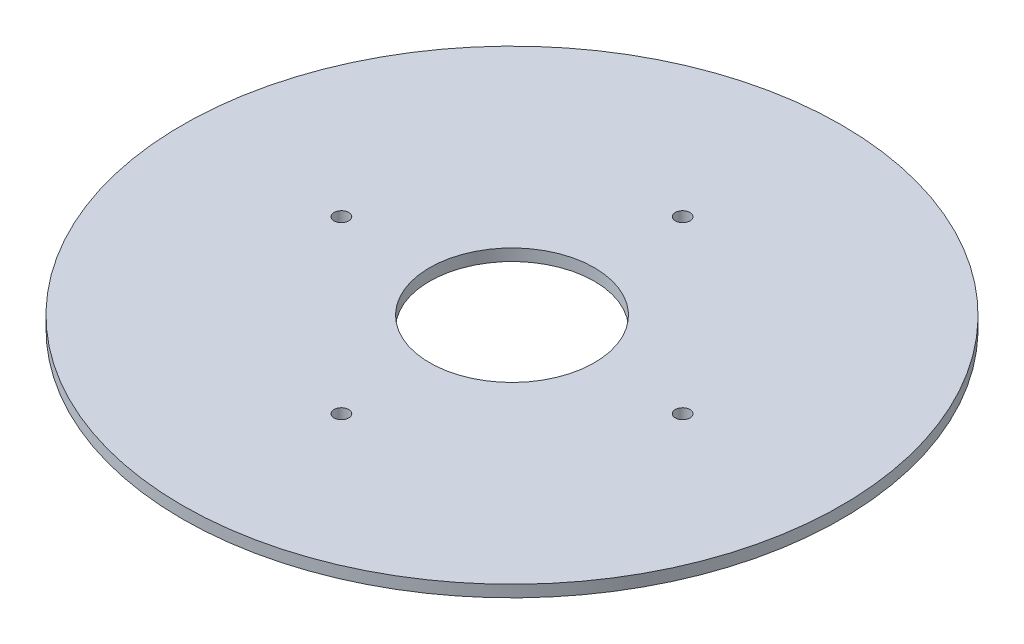
ISO-10303-21;
HEADER;
FILE_DESCRIPTION(('STEP AP214'),'2;1');
FILE_NAME('part.step','',(''),(''),'','','');
FILE_SCHEMA(('AUTOMOTIVE_DESIGN { 1 0 10303 214 1 1 1 1 }'));
ENDSEC;
DATA;
#1=APPLICATION_CONTEXT('core data for automotive mechanical design processes');
#2=APPLICATION_PROTOCOL_DEFINITION('international standard','automotive_design',2000,#1);
#3=PRODUCT_CONTEXT('',#1,'mechanical');
#4=PRODUCT('Part','Part','',(#3));
#5=PRODUCT_RELATED_PRODUCT_CATEGORY('part','',(#4));
#6=PRODUCT_DEFINITION_FORMATION('','',#4);
#7=PRODUCT_DEFINITION_CONTEXT('part definition',#1,'design');
#8=PRODUCT_DEFINITION('design','',#6,#7);
#9=PRODUCT_DEFINITION_SHAPE('','',#8);
#10=(LENGTH_UNIT() NAMED_UNIT(*) SI_UNIT(.MILLI.,.METRE.));
#11=(NAMED_UNIT(*) PLANE_ANGLE_UNIT() SI_UNIT($,.RADIAN.));
#12=(NAMED_UNIT(*) SI_UNIT($,.STERADIAN.) SOLID_ANGLE_UNIT());
#13=UNCERTAINTY_MEASURE_WITH_UNIT(LENGTH_MEASURE(1.E-05),#10,'distance_accuracy_value','');
#14=(GEOMETRIC_REPRESENTATION_CONTEXT(3) GLOBAL_UNCERTAINTY_ASSIGNED_CONTEXT((#13)) GLOBAL_UNIT_ASSIGNED_CONTEXT((#10,
#11,#12)) REPRESENTATION_CONTEXT('',''));
#15=CARTESIAN_POINT('',(0.,0.,0.));
#16=DIRECTION('',(0.,0.,1.));
#17=DIRECTION('',(1.,0.,0.));
#18=AXIS2_PLACEMENT_3D('',#15,#16,#17);
#19=CARTESIAN_POINT('',(0.,3.175,0.));
#20=DIRECTION('',(0.,1.,0.));
#21=DIRECTION('',(0.,0.,1.));
#22=AXIS2_PLACEMENT_3D('',#19,#20,#21);
#23=PLANE('',#22);
#24=CARTESIAN_POINT('',(0.,3.175,0.));
#25=DIRECTION('',(0.,-1.,0.));
#26=DIRECTION('',(0.,0.,-1.));
#27=AXIS2_PLACEMENT_3D('',#24,#25,#26);
#28=CIRCLE('',#27,22.225);
#29=CARTESIAN_POINT('',(0.,3.175,-22.225));
#30=VERTEX_POINT('',#29);
#31=EDGE_CURVE('E65',#30,#30,#28,.T.);
#32=ORIENTED_EDGE('',*,*,#31,.T.);
#33=EDGE_LOOP('',(#32));
#34=FACE_BOUND('',#33,.T.);
#35=CARTESIAN_POINT('',(0.,3.175,46.0327928766005));
#36=DIRECTION('',(0.,1.,0.));
#37=DIRECTION('',(0.,0.,1.));
#38=AXIS2_PLACEMENT_3D('',#35,#36,#37);
#39=CIRCLE('',#38,1.98437499999999);
#40=CARTESIAN_POINT('',(0.,3.175,48.0171678766005));
#41=VERTEX_POINT('',#40);
#42=EDGE_CURVE('E53',#41,#41,#39,.T.);
#43=ORIENTED_EDGE('',*,*,#42,.F.);
#44=EDGE_LOOP('',(#43));
#45=FACE_BOUND('',#44,.T.);
#46=CARTESIAN_POINT('',(0.,3.175,-46.0327928766005));
#47=DIRECTION('',(0.,1.,0.));
#48=DIRECTION('',(0.,0.,1.));
#49=AXIS2_PLACEMENT_3D('',#46,#47,#48);
#50=CIRCLE('',#49,1.98437499999999);
#51=CARTESIAN_POINT('',(0.,3.175,-44.0484178766005));
#52=VERTEX_POINT('',#51);
#53=EDGE_CURVE('E42',#52,#52,#50,.T.);
#54=ORIENTED_EDGE('',*,*,#53,.F.);
#55=EDGE_LOOP('',(#54));
#56=FACE_BOUND('',#55,.T.);
#57=CARTESIAN_POINT('',(0.,3.175,0.));
#58=DIRECTION('',(0.,1.,0.));
#59=DIRECTION('',(0.,0.,1.));
#60=AXIS2_PLACEMENT_3D('',#57,#58,#59);
#61=CIRCLE('',#60,88.9);
#62=CARTESIAN_POINT('',(0.,3.175,88.9));
#63=VERTEX_POINT('',#62);
#64=EDGE_CURVE('E10',#63,#63,#61,.T.);
#65=ORIENTED_EDGE('',*,*,#64,.T.);
#66=EDGE_LOOP('',(#65));
#67=FACE_BOUND('',#66,.T.);
#68=CARTESIAN_POINT('',(46.0327928766005,3.175,0.));
#69=DIRECTION('',(0.,1.,0.));
#70=DIRECTION('',(0.,0.,1.));
#71=AXIS2_PLACEMENT_3D('',#68,#69,#70);
#72=CIRCLE('',#71,1.984375);
#73=CARTESIAN_POINT('',(46.0327928766005,3.175,1.98437500000001));
#74=VERTEX_POINT('',#73);
#75=EDGE_CURVE('E47',#74,#74,#72,.T.);
#76=ORIENTED_EDGE('',*,*,#75,.F.);
#77=EDGE_LOOP('',(#76));
#78=FACE_BOUND('',#77,.T.);
#79=CARTESIAN_POINT('',(-46.0327928766005,3.175,0.));
#80=DIRECTION('',(0.,1.,0.));
#81=DIRECTION('',(0.,0.,1.));
#82=AXIS2_PLACEMENT_3D('',#79,#80,#81);
#83=CIRCLE('',#82,1.984375);
#84=CARTESIAN_POINT('',(-46.0327928766005,3.175,1.984375));
#85=VERTEX_POINT('',#84);
#86=EDGE_CURVE('E59',#85,#85,#83,.T.);
#87=ORIENTED_EDGE('',*,*,#86,.F.);
#88=EDGE_LOOP('',(#87));
#89=FACE_BOUND('',#88,.T.);
#90=ADVANCED_FACE('F31',(#34,#45,#56,#67,#78,#89),#23,.T.);
#91=CARTESIAN_POINT('',(0.,0.,0.));
#92=DIRECTION('',(0.,1.,0.));
#93=DIRECTION('',(0.,0.,1.));
#94=AXIS2_PLACEMENT_3D('',#91,#92,#93);
#95=PLANE('',#94);
#96=CARTESIAN_POINT('',(0.,0.,0.));
#97=DIRECTION('',(0.,-1.,0.));
#98=DIRECTION('',(0.,0.,-1.));
#99=AXIS2_PLACEMENT_3D('',#96,#97,#98);
#100=CIRCLE('',#99,22.225);
#101=CARTESIAN_POINT('',(0.,0.,-22.225));
#102=VERTEX_POINT('',#101);
#103=EDGE_CURVE('E68',#102,#102,#100,.T.);
#104=ORIENTED_EDGE('',*,*,#103,.F.);
#105=EDGE_LOOP('',(#104));
#106=FACE_BOUND('',#105,.T.);
#107=CARTESIAN_POINT('',(0.,0.,0.));
#108=DIRECTION('',(0.,1.,0.));
#109=DIRECTION('',(0.,0.,1.));
#110=AXIS2_PLACEMENT_3D('',#107,#108,#109);
#111=CIRCLE('',#110,88.9);
#112=CARTESIAN_POINT('',(0.,0.,88.9));
#113=VERTEX_POINT('',#112);
#114=EDGE_CURVE('E35',#113,#113,#111,.T.);
#115=ORIENTED_EDGE('',*,*,#114,.F.);
#116=EDGE_LOOP('',(#115));
#117=FACE_BOUND('',#116,.T.);
#118=CARTESIAN_POINT('',(0.,0.,-46.0327928766005));
#119=DIRECTION('',(0.,1.,0.));
#120=DIRECTION('',(0.,0.,1.));
#121=AXIS2_PLACEMENT_3D('',#118,#119,#120);
#122=CIRCLE('',#121,1.98437499999999);
#123=CARTESIAN_POINT('',(0.,0.,-44.0484178766005));
#124=VERTEX_POINT('',#123);
#125=EDGE_CURVE('E44',#124,#124,#122,.T.);
#126=ORIENTED_EDGE('',*,*,#125,.T.);
#127=EDGE_LOOP('',(#126));
#128=FACE_BOUND('',#127,.T.);
#129=CARTESIAN_POINT('',(46.0327928766005,0.,0.));
#130=DIRECTION('',(0.,1.,0.));
#131=DIRECTION('',(0.,0.,1.));
#132=AXIS2_PLACEMENT_3D('',#129,#130,#131);
#133=CIRCLE('',#132,1.984375);
#134=CARTESIAN_POINT('',(46.0327928766005,0.,1.98437500000001));
#135=VERTEX_POINT('',#134);
#136=EDGE_CURVE('E50',#135,#135,#133,.T.);
#137=ORIENTED_EDGE('',*,*,#136,.T.);
#138=EDGE_LOOP('',(#137));
#139=FACE_BOUND('',#138,.T.);
#140=CARTESIAN_POINT('',(0.,0.,46.0327928766005));
#141=DIRECTION('',(0.,1.,0.));
#142=DIRECTION('',(0.,0.,1.));
#143=AXIS2_PLACEMENT_3D('',#140,#141,#142);
#144=CIRCLE('',#143,1.98437499999999);
#145=CARTESIAN_POINT('',(0.,0.,48.0171678766005));
#146=VERTEX_POINT('',#145);
#147=EDGE_CURVE('E56',#146,#146,#144,.T.);
#148=ORIENTED_EDGE('',*,*,#147,.T.);
#149=EDGE_LOOP('',(#148));
#150=FACE_BOUND('',#149,.T.);
#151=CARTESIAN_POINT('',(-46.0327928766005,0.,0.));
#152=DIRECTION('',(0.,1.,0.));
#153=DIRECTION('',(0.,0.,1.));
#154=AXIS2_PLACEMENT_3D('',#151,#152,#153);
#155=CIRCLE('',#154,1.984375);
#156=CARTESIAN_POINT('',(-46.0327928766005,0.,1.984375));
#157=VERTEX_POINT('',#156);
#158=EDGE_CURVE('E62',#157,#157,#155,.T.);
#159=ORIENTED_EDGE('',*,*,#158,.T.);
#160=EDGE_LOOP('',(#159));
#161=FACE_BOUND('',#160,.T.);
#162=ADVANCED_FACE('F83',(#106,#117,#128,#139,#150,#161),#95,.F.);
#163=CARTESIAN_POINT('',(0.,3.175,0.));
#164=DIRECTION('',(0.,-1.,0.));
#165=DIRECTION('',(0.,0.,-1.));
#166=AXIS2_PLACEMENT_3D('',#163,#164,#165);
#167=CYLINDRICAL_SURFACE('',#166,88.9);
#168=ORIENTED_EDGE('',*,*,#64,.F.);
#169=EDGE_LOOP('',(#168));
#170=FACE_BOUND('',#169,.T.);
#171=ORIENTED_EDGE('',*,*,#114,.T.);
#172=EDGE_LOOP('',(#171));
#173=FACE_BOUND('',#172,.T.);
#174=ADVANCED_FACE('F33',(#170,#173),#167,.T.);
#175=CARTESIAN_POINT('',(0.,3.175,-46.0327928766005));
#176=DIRECTION('',(0.,-1.,0.));
#177=DIRECTION('',(0.,0.,-1.));
#178=AXIS2_PLACEMENT_3D('',#175,#176,#177);
#179=CYLINDRICAL_SURFACE('',#178,1.98437499999999);
#180=ORIENTED_EDGE('',*,*,#53,.T.);
#181=EDGE_LOOP('',(#180));
#182=FACE_BOUND('',#181,.T.);
#183=ORIENTED_EDGE('',*,*,#125,.F.);
#184=EDGE_LOOP('',(#183));
#185=FACE_BOUND('',#184,.T.);
#186=ADVANCED_FACE('F111',(#182,#185),#179,.F.);
#187=CARTESIAN_POINT('',(46.0327928766005,3.175,0.));
#188=DIRECTION('',(0.,-1.,0.));
#189=DIRECTION('',(0.,0.,-1.));
#190=AXIS2_PLACEMENT_3D('',#187,#188,#189);
#191=CYLINDRICAL_SURFACE('',#190,1.984375);
#192=ORIENTED_EDGE('',*,*,#75,.T.);
#193=EDGE_LOOP('',(#192));
#194=FACE_BOUND('',#193,.T.);
#195=ORIENTED_EDGE('',*,*,#136,.F.);
#196=EDGE_LOOP('',(#195));
#197=FACE_BOUND('',#196,.T.);
#198=ADVANCED_FACE('F103',(#194,#197),#191,.F.);
#199=CARTESIAN_POINT('',(0.,3.175,46.0327928766005));
#200=DIRECTION('',(0.,-1.,0.));
#201=DIRECTION('',(0.,0.,-1.));
#202=AXIS2_PLACEMENT_3D('',#199,#200,#201);
#203=CYLINDRICAL_SURFACE('',#202,1.98437499999999);
#204=ORIENTED_EDGE('',*,*,#42,.T.);
#205=EDGE_LOOP('',(#204));
#206=FACE_BOUND('',#205,.T.);
#207=ORIENTED_EDGE('',*,*,#147,.F.);
#208=EDGE_LOOP('',(#207));
#209=FACE_BOUND('',#208,.T.);
#210=ADVANCED_FACE('F97',(#206,#209),#203,.F.);
#211=CARTESIAN_POINT('',(-46.0327928766005,3.175,0.));
#212=DIRECTION('',(0.,-1.,0.));
#213=DIRECTION('',(0.,0.,-1.));
#214=AXIS2_PLACEMENT_3D('',#211,#212,#213);
#215=CYLINDRICAL_SURFACE('',#214,1.984375);
#216=ORIENTED_EDGE('',*,*,#86,.T.);
#217=EDGE_LOOP('',(#216));
#218=FACE_BOUND('',#217,.T.);
#219=ORIENTED_EDGE('',*,*,#158,.F.);
#220=EDGE_LOOP('',(#219));
#221=FACE_BOUND('',#220,.T.);
#222=ADVANCED_FACE('F79',(#218,#221),#215,.F.);
#223=CARTESIAN_POINT('',(0.,3.175,0.));
#224=DIRECTION('',(0.,-1.,0.));
#225=DIRECTION('',(0.,0.,-1.));
#226=AXIS2_PLACEMENT_3D('',#223,#224,#225);
#227=CYLINDRICAL_SURFACE('',#226,22.225);
#228=ORIENTED_EDGE('',*,*,#31,.F.);
#229=EDGE_LOOP('',(#228));
#230=FACE_BOUND('',#229,.T.);
#231=ORIENTED_EDGE('',*,*,#103,.T.);
#232=EDGE_LOOP('',(#231));
#233=FACE_BOUND('',#232,.T.);
#234=ADVANCED_FACE('F76',(#230,#233),#227,.F.);
#235=CLOSED_SHELL('',(#90,#162,#174,#186,#198,#210,#222,#234));
#236=MANIFOLD_SOLID_BREP('B2',#235);
#237=ADVANCED_BREP_SHAPE_REPRESENTATION('',(#18,#236),#14);
#238=SHAPE_DEFINITION_REPRESENTATION(#9,#237);
ENDSEC;
END-ISO-10303-21;
